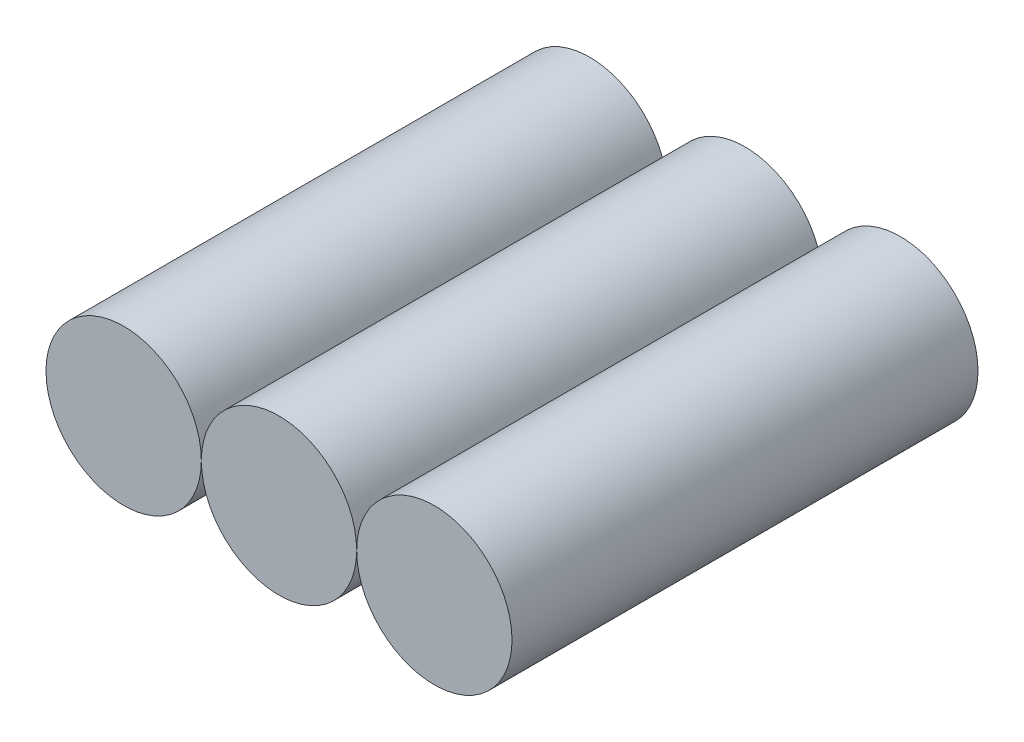
ISO-10303-21;
HEADER;
FILE_DESCRIPTION(('STEP AP214'),'2;1');
FILE_NAME('part.step','',(''),(''),'','','');
FILE_SCHEMA(('AUTOMOTIVE_DESIGN { 1 0 10303 214 1 1 1 1 }'));
ENDSEC;
DATA;
#1=APPLICATION_CONTEXT('core data for automotive mechanical design processes');
#2=APPLICATION_PROTOCOL_DEFINITION('international standard','automotive_design',2000,#1);
#3=PRODUCT_CONTEXT('',#1,'mechanical');
#4=PRODUCT('Part','Part','',(#3));
#5=PRODUCT_RELATED_PRODUCT_CATEGORY('part','',(#4));
#6=PRODUCT_DEFINITION_FORMATION('','',#4);
#7=PRODUCT_DEFINITION_CONTEXT('part definition',#1,'design');
#8=PRODUCT_DEFINITION('design','',#6,#7);
#9=PRODUCT_DEFINITION_SHAPE('','',#8);
#10=(LENGTH_UNIT() NAMED_UNIT(*) SI_UNIT(.MILLI.,.METRE.));
#11=(NAMED_UNIT(*) PLANE_ANGLE_UNIT() SI_UNIT($,.RADIAN.));
#12=(NAMED_UNIT(*) SI_UNIT($,.STERADIAN.) SOLID_ANGLE_UNIT());
#13=UNCERTAINTY_MEASURE_WITH_UNIT(LENGTH_MEASURE(1.E-05),#10,'distance_accuracy_value','');
#14=(GEOMETRIC_REPRESENTATION_CONTEXT(3) GLOBAL_UNCERTAINTY_ASSIGNED_CONTEXT((#13)) GLOBAL_UNIT_ASSIGNED_CONTEXT((#10,
#11,#12)) REPRESENTATION_CONTEXT('',''));
#15=CARTESIAN_POINT('',(0.,0.,0.));
#16=DIRECTION('',(0.,0.,1.));
#17=DIRECTION('',(1.,0.,0.));
#18=AXIS2_PLACEMENT_3D('',#15,#16,#17);
#19=CARTESIAN_POINT('',(3.98,2.,-23.99));
#20=DIRECTION('',(0.,0.,-1.));
#21=DIRECTION('',(-1.,0.,0.));
#22=AXIS2_PLACEMENT_3D('',#19,#20,#21);
#23=PLANE('',#22);
#24=CARTESIAN_POINT('',(3.98,2.,-23.99));
#25=DIRECTION('',(0.,0.,-1.));
#26=DIRECTION('',(-1.,0.,0.));
#27=AXIS2_PLACEMENT_3D('',#24,#25,#26);
#28=CIRCLE('',#27,0.5);
#29=CARTESIAN_POINT('',(3.48,2.,-23.99));
#30=VERTEX_POINT('',#29);
#31=EDGE_CURVE('P0_E18',#30,#30,#28,.T.);
#32=ORIENTED_EDGE('',*,*,#31,.F.);
#33=EDGE_LOOP('',(#32));
#34=FACE_BOUND('',#33,.T.);
#35=ADVANCED_FACE('P0_F15',(#34),#23,.F.);
#36=CARTESIAN_POINT('',(3.98,2.,-26.99));
#37=DIRECTION('',(0.,0.,-1.));
#38=DIRECTION('',(-1.,0.,0.));
#39=AXIS2_PLACEMENT_3D('',#36,#37,#38);
#40=PLANE('',#39);
#41=CARTESIAN_POINT('',(3.98,2.,-26.99));
#42=DIRECTION('',(0.,0.,-1.));
#43=DIRECTION('',(-1.,0.,0.));
#44=AXIS2_PLACEMENT_3D('',#41,#42,#43);
#45=CIRCLE('',#44,0.5);
#46=CARTESIAN_POINT('',(3.48,2.,-26.99));
#47=VERTEX_POINT('',#46);
#48=EDGE_CURVE('P0_E10',#47,#47,#45,.F.);
#49=ORIENTED_EDGE('',*,*,#48,.F.);
#50=EDGE_LOOP('',(#49));
#51=FACE_BOUND('',#50,.T.);
#52=ADVANCED_FACE('P0_F30',(#51),#40,.T.);
#53=CARTESIAN_POINT('',(3.98,2.,-23.99));
#54=DIRECTION('',(0.,0.,-1.));
#55=DIRECTION('',(-1.,0.,0.));
#56=AXIS2_PLACEMENT_3D('',#53,#54,#55);
#57=CYLINDRICAL_SURFACE('',#56,0.5);
#58=ORIENTED_EDGE('',*,*,#48,.T.);
#59=EDGE_LOOP('',(#58));
#60=FACE_BOUND('',#59,.T.);
#61=ORIENTED_EDGE('',*,*,#31,.T.);
#62=EDGE_LOOP('',(#61));
#63=FACE_BOUND('',#62,.T.);
#64=ADVANCED_FACE('P0_F27',(#60,#63),#57,.T.);
#65=CLOSED_SHELL('',(#35,#52,#64));
#66=MANIFOLD_SOLID_BREP('P0_B1',#65);
#67=CARTESIAN_POINT('',(5.98,2.,-26.99));
#68=DIRECTION('',(0.,0.,-1.));
#69=DIRECTION('',(-1.,0.,0.));
#70=AXIS2_PLACEMENT_3D('',#67,#68,#69);
#71=PLANE('',#70);
#72=CARTESIAN_POINT('',(5.98,2.,-26.99));
#73=DIRECTION('',(0.,0.,-1.));
#74=DIRECTION('',(-1.,0.,0.));
#75=AXIS2_PLACEMENT_3D('',#72,#73,#74);
#76=CIRCLE('',#75,0.5);
#77=CARTESIAN_POINT('',(5.48,2.,-26.99));
#78=VERTEX_POINT('',#77);
#79=EDGE_CURVE('P1_E18',#78,#78,#76,.F.);
#80=ORIENTED_EDGE('',*,*,#79,.F.);
#81=EDGE_LOOP('',(#80));
#82=FACE_BOUND('',#81,.T.);
#83=ADVANCED_FACE('P1_F15',(#82),#71,.T.);
#84=CARTESIAN_POINT('',(5.98,2.,-23.99));
#85=DIRECTION('',(0.,0.,-1.));
#86=DIRECTION('',(-1.,0.,0.));
#87=AXIS2_PLACEMENT_3D('',#84,#85,#86);
#88=PLANE('',#87);
#89=CARTESIAN_POINT('',(5.98,2.,-23.99));
#90=DIRECTION('',(0.,0.,-1.));
#91=DIRECTION('',(-1.,0.,0.));
#92=AXIS2_PLACEMENT_3D('',#89,#90,#91);
#93=CIRCLE('',#92,0.5);
#94=CARTESIAN_POINT('',(5.48,2.,-23.99));
#95=VERTEX_POINT('',#94);
#96=EDGE_CURVE('P1_E10',#95,#95,#93,.T.);
#97=ORIENTED_EDGE('',*,*,#96,.F.);
#98=EDGE_LOOP('',(#97));
#99=FACE_BOUND('',#98,.T.);
#100=ADVANCED_FACE('P1_F30',(#99),#88,.F.);
#101=CARTESIAN_POINT('',(5.98,2.,-23.99));
#102=DIRECTION('',(0.,0.,-1.));
#103=DIRECTION('',(-1.,0.,0.));
#104=AXIS2_PLACEMENT_3D('',#101,#102,#103);
#105=CYLINDRICAL_SURFACE('',#104,0.5);
#106=ORIENTED_EDGE('',*,*,#79,.T.);
#107=EDGE_LOOP('',(#106));
#108=FACE_BOUND('',#107,.T.);
#109=ORIENTED_EDGE('',*,*,#96,.T.);
#110=EDGE_LOOP('',(#109));
#111=FACE_BOUND('',#110,.T.);
#112=ADVANCED_FACE('P1_F27',(#108,#111),#105,.T.);
#113=CLOSED_SHELL('',(#83,#100,#112));
#114=MANIFOLD_SOLID_BREP('P1_B1',#113);
#115=CARTESIAN_POINT('',(4.98,2.,-26.99));
#116=DIRECTION('',(0.,0.,-1.));
#117=DIRECTION('',(-1.,0.,0.));
#118=AXIS2_PLACEMENT_3D('',#115,#116,#117);
#119=PLANE('',#118);
#120=CARTESIAN_POINT('',(4.98,2.,-26.99));
#121=DIRECTION('',(0.,0.,-1.));
#122=DIRECTION('',(-1.,0.,0.));
#123=AXIS2_PLACEMENT_3D('',#120,#121,#122);
#124=CIRCLE('',#123,0.5);
#125=CARTESIAN_POINT('',(4.48,2.,-26.99));
#126=VERTEX_POINT('',#125);
#127=EDGE_CURVE('P2_E18',#126,#126,#124,.F.);
#128=ORIENTED_EDGE('',*,*,#127,.F.);
#129=EDGE_LOOP('',(#128));
#130=FACE_BOUND('',#129,.T.);
#131=ADVANCED_FACE('P2_F15',(#130),#119,.T.);
#132=CARTESIAN_POINT('',(4.98,2.,-23.99));
#133=DIRECTION('',(0.,0.,-1.));
#134=DIRECTION('',(-1.,0.,0.));
#135=AXIS2_PLACEMENT_3D('',#132,#133,#134);
#136=PLANE('',#135);
#137=CARTESIAN_POINT('',(4.98,2.,-23.99));
#138=DIRECTION('',(0.,0.,-1.));
#139=DIRECTION('',(-1.,0.,0.));
#140=AXIS2_PLACEMENT_3D('',#137,#138,#139);
#141=CIRCLE('',#140,0.5);
#142=CARTESIAN_POINT('',(4.48,2.,-23.99));
#143=VERTEX_POINT('',#142);
#144=EDGE_CURVE('P2_E10',#143,#143,#141,.T.);
#145=ORIENTED_EDGE('',*,*,#144,.F.);
#146=EDGE_LOOP('',(#145));
#147=FACE_BOUND('',#146,.T.);
#148=ADVANCED_FACE('P2_F30',(#147),#136,.F.);
#149=CARTESIAN_POINT('',(4.98,2.,-23.99));
#150=DIRECTION('',(0.,0.,-1.));
#151=DIRECTION('',(-1.,0.,0.));
#152=AXIS2_PLACEMENT_3D('',#149,#150,#151);
#153=CYLINDRICAL_SURFACE('',#152,0.5);
#154=ORIENTED_EDGE('',*,*,#127,.T.);
#155=EDGE_LOOP('',(#154));
#156=FACE_BOUND('',#155,.T.);
#157=ORIENTED_EDGE('',*,*,#144,.T.);
#158=EDGE_LOOP('',(#157));
#159=FACE_BOUND('',#158,.T.);
#160=ADVANCED_FACE('P2_F27',(#156,#159),#153,.T.);
#161=CLOSED_SHELL('',(#131,#148,#160));
#162=MANIFOLD_SOLID_BREP('P2_B1',#161);
#163=ADVANCED_BREP_SHAPE_REPRESENTATION('',(#18,#66,#114,#162),#14);
#164=SHAPE_DEFINITION_REPRESENTATION(#9,#163);
ENDSEC;
END-ISO-10303-21;
